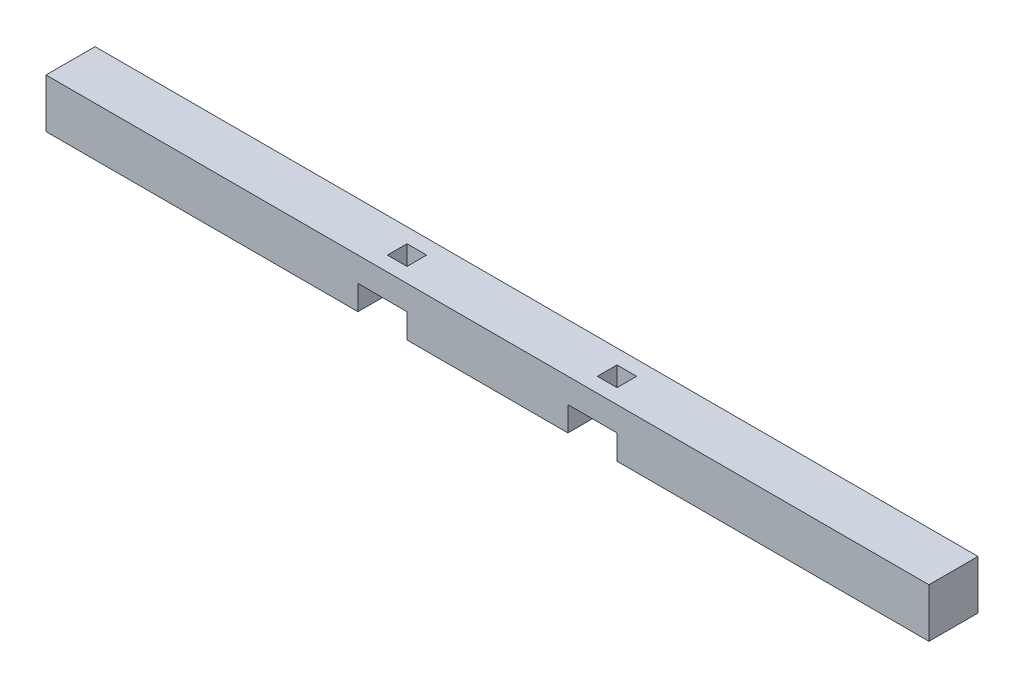
ISO-10303-21;
HEADER;
FILE_DESCRIPTION(('STEP AP214'),'2;1');
FILE_NAME('part.step','',(''),(''),'','','');
FILE_SCHEMA(('AUTOMOTIVE_DESIGN { 1 0 10303 214 1 1 1 1 }'));
ENDSEC;
DATA;
#1=APPLICATION_CONTEXT('core data for automotive mechanical design processes');
#2=APPLICATION_PROTOCOL_DEFINITION('international standard','automotive_design',2000,#1);
#3=PRODUCT_CONTEXT('',#1,'mechanical');
#4=PRODUCT('Part','Part','',(#3));
#5=PRODUCT_RELATED_PRODUCT_CATEGORY('part','',(#4));
#6=PRODUCT_DEFINITION_FORMATION('','',#4);
#7=PRODUCT_DEFINITION_CONTEXT('part definition',#1,'design');
#8=PRODUCT_DEFINITION('design','',#6,#7);
#9=PRODUCT_DEFINITION_SHAPE('','',#8);
#10=(LENGTH_UNIT() NAMED_UNIT(*) SI_UNIT(.MILLI.,.METRE.));
#11=(NAMED_UNIT(*) PLANE_ANGLE_UNIT() SI_UNIT($,.RADIAN.));
#12=(NAMED_UNIT(*) SI_UNIT($,.STERADIAN.) SOLID_ANGLE_UNIT());
#13=UNCERTAINTY_MEASURE_WITH_UNIT(LENGTH_MEASURE(1.E-05),#10,'distance_accuracy_value','');
#14=(GEOMETRIC_REPRESENTATION_CONTEXT(3) GLOBAL_UNCERTAINTY_ASSIGNED_CONTEXT((#13)) GLOBAL_UNIT_ASSIGNED_CONTEXT((#10,
#11,#12)) REPRESENTATION_CONTEXT('',''));
#15=CARTESIAN_POINT('',(0.,0.,0.));
#16=DIRECTION('',(0.,0.,1.));
#17=DIRECTION('',(1.,0.,0.));
#18=AXIS2_PLACEMENT_3D('',#15,#16,#17);
#19=CARTESIAN_POINT('',(450.,0.,0.));
#20=DIRECTION('',(0.,1.,0.));
#21=DIRECTION('',(0.,0.,1.));
#22=AXIS2_PLACEMENT_3D('',#19,#20,#21);
#23=PLANE('',#22);
#24=DIRECTION('',(-1.,0.,0.));
#25=VECTOR('',#24,1.);
#26=CARTESIAN_POINT('',(450.,0.,0.));
#27=LINE('',#26,#25);
#28=CARTESIAN_POINT('',(266.,0.,0.));
#29=VERTEX_POINT('',#28);
#30=CARTESIAN_POINT('',(184.,0.,0.));
#31=VERTEX_POINT('',#30);
#32=EDGE_CURVE('E322',#29,#31,#27,.T.);
#33=ORIENTED_EDGE('',*,*,#32,.T.);
#34=DIRECTION('',(0.,0.,1.));
#35=VECTOR('',#34,1.);
#36=CARTESIAN_POINT('',(184.,0.,0.));
#37=LINE('',#36,#35);
#38=CARTESIAN_POINT('',(184.,0.,-25.));
#39=VERTEX_POINT('',#38);
#40=EDGE_CURVE('E183',#39,#31,#37,.T.);
#41=ORIENTED_EDGE('',*,*,#40,.F.);
#42=DIRECTION('',(-1.,0.,0.));
#43=VECTOR('',#42,1.);
#44=CARTESIAN_POINT('',(450.,0.,-25.));
#45=LINE('',#44,#43);
#46=CARTESIAN_POINT('',(266.,0.,-25.));
#47=VERTEX_POINT('',#46);
#48=EDGE_CURVE('E319',#47,#39,#45,.T.);
#49=ORIENTED_EDGE('',*,*,#48,.F.);
#50=DIRECTION('',(0.,0.,-1.));
#51=VECTOR('',#50,1.);
#52=CARTESIAN_POINT('',(266.,0.,0.));
#53=LINE('',#52,#51);
#54=EDGE_CURVE('E218',#29,#47,#53,.T.);
#55=ORIENTED_EDGE('',*,*,#54,.F.);
#56=EDGE_LOOP('',(#33,#41,#49,#55));
#57=FACE_BOUND('',#56,.T.);
#58=ADVANCED_FACE('F40',(#57),#23,.F.);
#59=CARTESIAN_POINT('',(450.,0.,0.));
#60=VERTEX_POINT('',#59);
#61=CARTESIAN_POINT('',(291.,0.,0.));
#62=VERTEX_POINT('',#61);
#63=EDGE_CURVE('E320',#60,#62,#27,.T.);
#64=ORIENTED_EDGE('',*,*,#63,.T.);
#65=DIRECTION('',(0.,0.,1.));
#66=VECTOR('',#65,1.);
#67=CARTESIAN_POINT('',(291.,0.,0.));
#68=LINE('',#67,#66);
#69=CARTESIAN_POINT('',(291.,0.,-25.));
#70=VERTEX_POINT('',#69);
#71=EDGE_CURVE('E224',#70,#62,#68,.T.);
#72=ORIENTED_EDGE('',*,*,#71,.F.);
#73=CARTESIAN_POINT('',(450.,0.,-25.));
#74=VERTEX_POINT('',#73);
#75=EDGE_CURVE('E315',#74,#70,#45,.T.);
#76=ORIENTED_EDGE('',*,*,#75,.F.);
#77=DIRECTION('',(0.,0.,-1.));
#78=VECTOR('',#77,1.);
#79=CARTESIAN_POINT('',(450.,0.,0.));
#80=LINE('',#79,#78);
#81=EDGE_CURVE('E293',#60,#74,#80,.T.);
#82=ORIENTED_EDGE('',*,*,#81,.F.);
#83=EDGE_LOOP('',(#64,#72,#76,#82));
#84=FACE_BOUND('',#83,.T.);
#85=ADVANCED_FACE('F347',(#84),#23,.F.);
#86=CARTESIAN_POINT('',(176.5,0.,-7.5));
#87=DIRECTION('',(1.,0.,0.));
#88=DIRECTION('',(0.,0.,-1.));
#89=AXIS2_PLACEMENT_3D('',#86,#87,#88);
#90=PLANE('',#89);
#91=DIRECTION('',(0.,0.,-1.));
#92=VECTOR('',#91,1.);
#93=CARTESIAN_POINT('',(176.5,12.5,-7.5));
#94=LINE('',#93,#92);
#95=CARTESIAN_POINT('',(176.5,12.5,-7.5));
#96=VERTEX_POINT('',#95);
#97=CARTESIAN_POINT('',(176.5,12.5,-17.5));
#98=VERTEX_POINT('',#97);
#99=EDGE_CURVE('E238',#96,#98,#94,.T.);
#100=ORIENTED_EDGE('',*,*,#99,.F.);
#101=DIRECTION('',(0.,1.,0.));
#102=VECTOR('',#101,1.);
#103=CARTESIAN_POINT('',(176.5,0.,-7.5));
#104=LINE('',#103,#102);
#105=CARTESIAN_POINT('',(176.5,25.,-7.5));
#106=VERTEX_POINT('',#105);
#107=EDGE_CURVE('E264',#96,#106,#104,.T.);
#108=ORIENTED_EDGE('',*,*,#107,.T.);
#109=DIRECTION('',(0.,0.,-1.));
#110=VECTOR('',#109,1.);
#111=CARTESIAN_POINT('',(176.5,25.,-7.5));
#112=LINE('',#111,#110);
#113=CARTESIAN_POINT('',(176.5,25.,-17.5));
#114=VERTEX_POINT('',#113);
#115=EDGE_CURVE('E250',#106,#114,#112,.T.);
#116=ORIENTED_EDGE('',*,*,#115,.T.);
#117=DIRECTION('',(0.,1.,0.));
#118=VECTOR('',#117,1.);
#119=CARTESIAN_POINT('',(176.5,0.,-17.5));
#120=LINE('',#119,#118);
#121=EDGE_CURVE('E263',#98,#114,#120,.T.);
#122=ORIENTED_EDGE('',*,*,#121,.F.);
#123=EDGE_LOOP('',(#100,#108,#116,#122));
#124=FACE_BOUND('',#123,.T.);
#125=ADVANCED_FACE('F345',(#124),#90,.F.);
#126=CARTESIAN_POINT('',(166.5,0.,-7.5));
#127=DIRECTION('',(0.,0.,1.));
#128=DIRECTION('',(1.,0.,0.));
#129=AXIS2_PLACEMENT_3D('',#126,#127,#128);
#130=PLANE('',#129);
#131=DIRECTION('',(1.,0.,0.));
#132=VECTOR('',#131,1.);
#133=CARTESIAN_POINT('',(166.5,12.5,-7.5));
#134=LINE('',#133,#132);
#135=CARTESIAN_POINT('',(166.5,12.5,-7.5));
#136=VERTEX_POINT('',#135);
#137=EDGE_CURVE('E236',#136,#96,#134,.T.);
#138=ORIENTED_EDGE('',*,*,#137,.F.);
#139=DIRECTION('',(0.,1.,0.));
#140=VECTOR('',#139,1.);
#141=CARTESIAN_POINT('',(166.5,0.,-7.5));
#142=LINE('',#141,#140);
#143=CARTESIAN_POINT('',(166.5,25.,-7.5));
#144=VERTEX_POINT('',#143);
#145=EDGE_CURVE('E267',#136,#144,#142,.T.);
#146=ORIENTED_EDGE('',*,*,#145,.T.);
#147=DIRECTION('',(1.,0.,0.));
#148=VECTOR('',#147,1.);
#149=CARTESIAN_POINT('',(166.5,25.,-7.5));
#150=LINE('',#149,#148);
#151=EDGE_CURVE('E260',#144,#106,#150,.T.);
#152=ORIENTED_EDGE('',*,*,#151,.T.);
#153=ORIENTED_EDGE('',*,*,#107,.F.);
#154=EDGE_LOOP('',(#138,#146,#152,#153));
#155=FACE_BOUND('',#154,.T.);
#156=ADVANCED_FACE('F343',(#155),#130,.F.);
#157=CARTESIAN_POINT('',(166.5,0.,-7.5));
#158=DIRECTION('',(-1.,0.,0.));
#159=DIRECTION('',(0.,0.,1.));
#160=AXIS2_PLACEMENT_3D('',#157,#158,#159);
#161=PLANE('',#160);
#162=DIRECTION('',(0.,0.,1.));
#163=VECTOR('',#162,1.);
#164=CARTESIAN_POINT('',(166.5,12.5,-7.5));
#165=LINE('',#164,#163);
#166=CARTESIAN_POINT('',(166.5,12.5,-17.5));
#167=VERTEX_POINT('',#166);
#168=EDGE_CURVE('E209',#167,#136,#165,.T.);
#169=ORIENTED_EDGE('',*,*,#168,.F.);
#170=DIRECTION('',(0.,1.,0.));
#171=VECTOR('',#170,1.);
#172=CARTESIAN_POINT('',(166.5,0.,-17.5));
#173=LINE('',#172,#171);
#174=CARTESIAN_POINT('',(166.5,25.,-17.5));
#175=VERTEX_POINT('',#174);
#176=EDGE_CURVE('E269',#167,#175,#173,.T.);
#177=ORIENTED_EDGE('',*,*,#176,.T.);
#178=DIRECTION('',(0.,0.,1.));
#179=VECTOR('',#178,1.);
#180=CARTESIAN_POINT('',(166.5,25.,-7.5));
#181=LINE('',#180,#179);
#182=EDGE_CURVE('E257',#175,#144,#181,.T.);
#183=ORIENTED_EDGE('',*,*,#182,.T.);
#184=ORIENTED_EDGE('',*,*,#145,.F.);
#185=EDGE_LOOP('',(#169,#177,#183,#184));
#186=FACE_BOUND('',#185,.T.);
#187=ADVANCED_FACE('F332',(#186),#161,.F.);
#188=CARTESIAN_POINT('',(166.5,0.,-17.5));
#189=DIRECTION('',(0.,0.,-1.));
#190=DIRECTION('',(-1.,0.,0.));
#191=AXIS2_PLACEMENT_3D('',#188,#189,#190);
#192=PLANE('',#191);
#193=DIRECTION('',(-1.,0.,0.));
#194=VECTOR('',#193,1.);
#195=CARTESIAN_POINT('',(166.5,12.5,-17.5));
#196=LINE('',#195,#194);
#197=EDGE_CURVE('E48',#98,#167,#196,.T.);
#198=ORIENTED_EDGE('',*,*,#197,.F.);
#199=ORIENTED_EDGE('',*,*,#121,.T.);
#200=DIRECTION('',(-1.,0.,0.));
#201=VECTOR('',#200,1.);
#202=CARTESIAN_POINT('',(166.5,25.,-17.5));
#203=LINE('',#202,#201);
#204=EDGE_CURVE('E253',#114,#175,#203,.T.);
#205=ORIENTED_EDGE('',*,*,#204,.T.);
#206=ORIENTED_EDGE('',*,*,#176,.F.);
#207=EDGE_LOOP('',(#198,#199,#205,#206));
#208=FACE_BOUND('',#207,.T.);
#209=ADVANCED_FACE('F333',(#208),#192,.F.);
#210=CARTESIAN_POINT('',(450.,0.,0.));
#211=DIRECTION('',(0.,0.,-1.));
#212=DIRECTION('',(-1.,0.,0.));
#213=AXIS2_PLACEMENT_3D('',#210,#211,#212);
#214=PLANE('',#213);
#215=DIRECTION('',(-1.,0.,0.));
#216=VECTOR('',#215,1.);
#217=CARTESIAN_POINT('',(159.,12.5,0.));
#218=LINE('',#217,#216);
#219=CARTESIAN_POINT('',(184.,12.5,0.));
#220=VERTEX_POINT('',#219);
#221=CARTESIAN_POINT('',(159.,12.5,0.));
#222=VERTEX_POINT('',#221);
#223=EDGE_CURVE('E193',#220,#222,#218,.T.);
#224=ORIENTED_EDGE('',*,*,#223,.F.);
#225=DIRECTION('',(0.,-1.,0.));
#226=VECTOR('',#225,1.);
#227=CARTESIAN_POINT('',(184.,12.5,0.));
#228=LINE('',#227,#226);
#229=EDGE_CURVE('E178',#220,#31,#228,.T.);
#230=ORIENTED_EDGE('',*,*,#229,.T.);
#231=ORIENTED_EDGE('',*,*,#32,.F.);
#232=DIRECTION('',(0.,-1.,0.));
#233=VECTOR('',#232,1.);
#234=CARTESIAN_POINT('',(266.,12.5,0.));
#235=LINE('',#234,#233);
#236=CARTESIAN_POINT('',(266.,12.5,0.));
#237=VERTEX_POINT('',#236);
#238=EDGE_CURVE('E231',#237,#29,#235,.T.);
#239=ORIENTED_EDGE('',*,*,#238,.F.);
#240=DIRECTION('',(-1.,0.,0.));
#241=VECTOR('',#240,1.);
#242=CARTESIAN_POINT('',(291.,12.5,0.));
#243=LINE('',#242,#241);
#244=CARTESIAN_POINT('',(291.,12.5,0.));
#245=VERTEX_POINT('',#244);
#246=EDGE_CURVE('E217',#245,#237,#243,.T.);
#247=ORIENTED_EDGE('',*,*,#246,.F.);
#248=DIRECTION('',(0.,-1.,0.));
#249=VECTOR('',#248,1.);
#250=CARTESIAN_POINT('',(291.,12.5,0.));
#251=LINE('',#250,#249);
#252=EDGE_CURVE('E223',#245,#62,#251,.T.);
#253=ORIENTED_EDGE('',*,*,#252,.T.);
#254=ORIENTED_EDGE('',*,*,#63,.F.);
#255=DIRECTION('',(0.,-1.,0.));
#256=VECTOR('',#255,1.);
#257=CARTESIAN_POINT('',(450.,0.,0.));
#258=LINE('',#257,#256);
#259=CARTESIAN_POINT('',(450.,25.,0.));
#260=VERTEX_POINT('',#259);
#261=EDGE_CURVE('E290',#260,#60,#258,.T.);
#262=ORIENTED_EDGE('',*,*,#261,.F.);
#263=DIRECTION('',(-1.,0.,0.));
#264=VECTOR('',#263,1.);
#265=CARTESIAN_POINT('',(450.,25.,0.));
#266=LINE('',#265,#264);
#267=CARTESIAN_POINT('',(0.,25.,0.));
#268=VERTEX_POINT('',#267);
#269=EDGE_CURVE('E300',#260,#268,#266,.T.);
#270=ORIENTED_EDGE('',*,*,#269,.T.);
#271=DIRECTION('',(0.,-1.,0.));
#272=VECTOR('',#271,1.);
#273=CARTESIAN_POINT('',(0.,0.,0.));
#274=LINE('',#273,#272);
#275=CARTESIAN_POINT('',(0.,0.,0.));
#276=VERTEX_POINT('',#275);
#277=EDGE_CURVE('E266',#268,#276,#274,.T.);
#278=ORIENTED_EDGE('',*,*,#277,.T.);
#279=CARTESIAN_POINT('',(159.,0.,0.));
#280=VERTEX_POINT('',#279);
#281=EDGE_CURVE('E318',#280,#276,#27,.T.);
#282=ORIENTED_EDGE('',*,*,#281,.F.);
#283=DIRECTION('',(0.,-1.,0.));
#284=VECTOR('',#283,1.);
#285=CARTESIAN_POINT('',(159.,12.5,0.));
#286=LINE('',#285,#284);
#287=EDGE_CURVE('E188',#222,#280,#286,.T.);
#288=ORIENTED_EDGE('',*,*,#287,.F.);
#289=EDGE_LOOP('',(#224,#230,#231,#239,#247,#253,#254,#262,#270,#278,#282,#288));
#290=FACE_BOUND('',#289,.T.);
#291=ADVANCED_FACE('F42',(#290),#214,.F.);
#292=CARTESIAN_POINT('',(159.,0.,-25.));
#293=VERTEX_POINT('',#292);
#294=CARTESIAN_POINT('',(0.,0.,-25.));
#295=VERTEX_POINT('',#294);
#296=EDGE_CURVE('E314',#293,#295,#45,.T.);
#297=ORIENTED_EDGE('',*,*,#296,.F.);
#298=DIRECTION('',(0.,0.,-1.));
#299=VECTOR('',#298,1.);
#300=CARTESIAN_POINT('',(159.,0.,0.));
#301=LINE('',#300,#299);
#302=EDGE_CURVE('E197',#280,#293,#301,.T.);
#303=ORIENTED_EDGE('',*,*,#302,.F.);
#304=ORIENTED_EDGE('',*,*,#281,.T.);
#305=DIRECTION('',(0.,0.,-1.));
#306=VECTOR('',#305,1.);
#307=CARTESIAN_POINT('',(0.,0.,0.));
#308=LINE('',#307,#306);
#309=EDGE_CURVE('E303',#276,#295,#308,.T.);
#310=ORIENTED_EDGE('',*,*,#309,.T.);
#311=EDGE_LOOP('',(#297,#303,#304,#310));
#312=FACE_BOUND('',#311,.T.);
#313=ADVANCED_FACE('F355',(#312),#23,.F.);
#314=CARTESIAN_POINT('',(450.,0.,-25.));
#315=DIRECTION('',(0.,0.,1.));
#316=DIRECTION('',(1.,0.,0.));
#317=AXIS2_PLACEMENT_3D('',#314,#315,#316);
#318=PLANE('',#317);
#319=ORIENTED_EDGE('',*,*,#48,.T.);
#320=DIRECTION('',(0.,-1.,0.));
#321=VECTOR('',#320,1.);
#322=CARTESIAN_POINT('',(184.,12.5,-25.));
#323=LINE('',#322,#321);
#324=CARTESIAN_POINT('',(184.,12.5,-25.));
#325=VERTEX_POINT('',#324);
#326=EDGE_CURVE('E207',#325,#39,#323,.T.);
#327=ORIENTED_EDGE('',*,*,#326,.F.);
#328=DIRECTION('',(1.,0.,0.));
#329=VECTOR('',#328,1.);
#330=CARTESIAN_POINT('',(159.,12.5,-25.));
#331=LINE('',#330,#329);
#332=CARTESIAN_POINT('',(159.,12.5,-25.));
#333=VERTEX_POINT('',#332);
#334=EDGE_CURVE('E189',#333,#325,#331,.T.);
#335=ORIENTED_EDGE('',*,*,#334,.F.);
#336=DIRECTION('',(0.,-1.,0.));
#337=VECTOR('',#336,1.);
#338=CARTESIAN_POINT('',(159.,12.5,-25.));
#339=LINE('',#338,#337);
#340=EDGE_CURVE('E210',#333,#293,#339,.T.);
#341=ORIENTED_EDGE('',*,*,#340,.T.);
#342=ORIENTED_EDGE('',*,*,#296,.T.);
#343=DIRECTION('',(0.,1.,0.));
#344=VECTOR('',#343,1.);
#345=CARTESIAN_POINT('',(0.,0.,-25.));
#346=LINE('',#345,#344);
#347=CARTESIAN_POINT('',(0.,25.,-25.));
#348=VERTEX_POINT('',#347);
#349=EDGE_CURVE('E306',#295,#348,#346,.T.);
#350=ORIENTED_EDGE('',*,*,#349,.T.);
#351=DIRECTION('',(-1.,0.,0.));
#352=VECTOR('',#351,1.);
#353=CARTESIAN_POINT('',(450.,25.,-25.));
#354=LINE('',#353,#352);
#355=CARTESIAN_POINT('',(450.,25.,-25.));
#356=VERTEX_POINT('',#355);
#357=EDGE_CURVE('E311',#356,#348,#354,.T.);
#358=ORIENTED_EDGE('',*,*,#357,.F.);
#359=DIRECTION('',(0.,1.,0.));
#360=VECTOR('',#359,1.);
#361=CARTESIAN_POINT('',(450.,0.,-25.));
#362=LINE('',#361,#360);
#363=EDGE_CURVE('E296',#74,#356,#362,.T.);
#364=ORIENTED_EDGE('',*,*,#363,.F.);
#365=ORIENTED_EDGE('',*,*,#75,.T.);
#366=DIRECTION('',(0.,-1.,0.));
#367=VECTOR('',#366,1.);
#368=CARTESIAN_POINT('',(291.,12.5,-25.));
#369=LINE('',#368,#367);
#370=CARTESIAN_POINT('',(291.,12.5,-25.));
#371=VERTEX_POINT('',#370);
#372=EDGE_CURVE('E205',#371,#70,#369,.T.);
#373=ORIENTED_EDGE('',*,*,#372,.F.);
#374=DIRECTION('',(1.,0.,0.));
#375=VECTOR('',#374,1.);
#376=CARTESIAN_POINT('',(291.,12.5,-25.));
#377=LINE('',#376,#375);
#378=CARTESIAN_POINT('',(266.,12.5,-25.));
#379=VERTEX_POINT('',#378);
#380=EDGE_CURVE('E221',#379,#371,#377,.T.);
#381=ORIENTED_EDGE('',*,*,#380,.F.);
#382=DIRECTION('',(0.,-1.,0.));
#383=VECTOR('',#382,1.);
#384=CARTESIAN_POINT('',(266.,12.5,-25.));
#385=LINE('',#384,#383);
#386=EDGE_CURVE('E228',#379,#47,#385,.T.);
#387=ORIENTED_EDGE('',*,*,#386,.T.);
#388=EDGE_LOOP('',(#319,#327,#335,#341,#342,#350,#358,#364,#365,#373,#381,#387));
#389=FACE_BOUND('',#388,.T.);
#390=ADVANCED_FACE('F364',(#389),#318,.F.);
#391=CARTESIAN_POINT('',(450.,25.,0.));
#392=DIRECTION('',(0.,-1.,0.));
#393=DIRECTION('',(0.,0.,-1.));
#394=AXIS2_PLACEMENT_3D('',#391,#392,#393);
#395=PLANE('',#394);
#396=ORIENTED_EDGE('',*,*,#204,.F.);
#397=ORIENTED_EDGE('',*,*,#115,.F.);
#398=ORIENTED_EDGE('',*,*,#151,.F.);
#399=ORIENTED_EDGE('',*,*,#182,.F.);
#400=EDGE_LOOP('',(#396,#397,#398,#399));
#401=FACE_BOUND('',#400,.T.);
#402=DIRECTION('',(-1.,0.,0.));
#403=VECTOR('',#402,1.);
#404=CARTESIAN_POINT('',(283.5,25.,-17.5));
#405=LINE('',#404,#403);
#406=CARTESIAN_POINT('',(283.5,25.,-17.5));
#407=VERTEX_POINT('',#406);
#408=CARTESIAN_POINT('',(273.5,25.,-17.5));
#409=VERTEX_POINT('',#408);
#410=EDGE_CURVE('E274',#407,#409,#405,.T.);
#411=ORIENTED_EDGE('',*,*,#410,.F.);
#412=DIRECTION('',(0.,0.,-1.));
#413=VECTOR('',#412,1.);
#414=CARTESIAN_POINT('',(283.5,25.,-7.50000000000001));
#415=LINE('',#414,#413);
#416=CARTESIAN_POINT('',(283.5,25.,-7.50000000000001));
#417=VERTEX_POINT('',#416);
#418=EDGE_CURVE('E249',#417,#407,#415,.T.);
#419=ORIENTED_EDGE('',*,*,#418,.F.);
#420=DIRECTION('',(1.,0.,0.));
#421=VECTOR('',#420,1.);
#422=CARTESIAN_POINT('',(283.5,25.,-7.50000000000001));
#423=LINE('',#422,#421);
#424=CARTESIAN_POINT('',(273.5,25.,-7.50000000000001));
#425=VERTEX_POINT('',#424);
#426=EDGE_CURVE('E280',#425,#417,#423,.T.);
#427=ORIENTED_EDGE('',*,*,#426,.F.);
#428=DIRECTION('',(0.,0.,1.));
#429=VECTOR('',#428,1.);
#430=CARTESIAN_POINT('',(273.5,25.,-7.50000000000001));
#431=LINE('',#430,#429);
#432=EDGE_CURVE('E277',#409,#425,#431,.T.);
#433=ORIENTED_EDGE('',*,*,#432,.F.);
#434=EDGE_LOOP('',(#411,#419,#427,#433));
#435=FACE_BOUND('',#434,.T.);
#436=DIRECTION('',(0.,0.,1.));
#437=VECTOR('',#436,1.);
#438=CARTESIAN_POINT('',(0.,25.,0.));
#439=LINE('',#438,#437);
#440=EDGE_CURVE('E294',#348,#268,#439,.T.);
#441=ORIENTED_EDGE('',*,*,#440,.T.);
#442=ORIENTED_EDGE('',*,*,#269,.F.);
#443=DIRECTION('',(0.,0.,1.));
#444=VECTOR('',#443,1.);
#445=CARTESIAN_POINT('',(450.,25.,0.));
#446=LINE('',#445,#444);
#447=EDGE_CURVE('E298',#356,#260,#446,.T.);
#448=ORIENTED_EDGE('',*,*,#447,.F.);
#449=ORIENTED_EDGE('',*,*,#357,.T.);
#450=EDGE_LOOP('',(#441,#442,#448,#449));
#451=FACE_BOUND('',#450,.T.);
#452=ADVANCED_FACE('F339',(#401,#435,#451),#395,.F.);
#453=CARTESIAN_POINT('',(450.,0.,0.));
#454=DIRECTION('',(-1.,0.,0.));
#455=DIRECTION('',(0.,0.,1.));
#456=AXIS2_PLACEMENT_3D('',#453,#454,#455);
#457=PLANE('',#456);
#458=ORIENTED_EDGE('',*,*,#261,.T.);
#459=ORIENTED_EDGE('',*,*,#81,.T.);
#460=ORIENTED_EDGE('',*,*,#363,.T.);
#461=ORIENTED_EDGE('',*,*,#447,.T.);
#462=EDGE_LOOP('',(#458,#459,#460,#461));
#463=FACE_BOUND('',#462,.T.);
#464=ADVANCED_FACE('F394',(#463),#457,.F.);
#465=CARTESIAN_POINT('',(0.,0.,0.));
#466=DIRECTION('',(-1.,0.,0.));
#467=DIRECTION('',(0.,0.,1.));
#468=AXIS2_PLACEMENT_3D('',#465,#466,#467);
#469=PLANE('',#468);
#470=ORIENTED_EDGE('',*,*,#277,.F.);
#471=ORIENTED_EDGE('',*,*,#440,.F.);
#472=ORIENTED_EDGE('',*,*,#349,.F.);
#473=ORIENTED_EDGE('',*,*,#309,.F.);
#474=EDGE_LOOP('',(#470,#471,#472,#473));
#475=FACE_BOUND('',#474,.T.);
#476=ADVANCED_FACE('F382',(#475),#469,.T.);
#477=CARTESIAN_POINT('',(283.5,0.,-7.50000000000001));
#478=DIRECTION('',(1.,0.,0.));
#479=DIRECTION('',(0.,0.,-1.));
#480=AXIS2_PLACEMENT_3D('',#477,#478,#479);
#481=PLANE('',#480);
#482=DIRECTION('',(0.,1.,0.));
#483=VECTOR('',#482,1.);
#484=CARTESIAN_POINT('',(283.5,0.,-17.5));
#485=LINE('',#484,#483);
#486=CARTESIAN_POINT('',(283.5,12.5,-17.5));
#487=VERTEX_POINT('',#486);
#488=EDGE_CURVE('E283',#487,#407,#485,.T.);
#489=ORIENTED_EDGE('',*,*,#488,.F.);
#490=DIRECTION('',(0.,0.,1.));
#491=VECTOR('',#490,1.);
#492=CARTESIAN_POINT('',(283.5,12.5,-7.50000000000001));
#493=LINE('',#492,#491);
#494=CARTESIAN_POINT('',(283.5,12.5,-7.50000000000001));
#495=VERTEX_POINT('',#494);
#496=EDGE_CURVE('E246',#487,#495,#493,.T.);
#497=ORIENTED_EDGE('',*,*,#496,.T.);
#498=DIRECTION('',(0.,1.,0.));
#499=VECTOR('',#498,1.);
#500=CARTESIAN_POINT('',(283.5,0.,-7.50000000000001));
#501=LINE('',#500,#499);
#502=EDGE_CURVE('E254',#495,#417,#501,.T.);
#503=ORIENTED_EDGE('',*,*,#502,.T.);
#504=ORIENTED_EDGE('',*,*,#418,.T.);
#505=EDGE_LOOP('',(#489,#497,#503,#504));
#506=FACE_BOUND('',#505,.T.);
#507=ADVANCED_FACE('F419',(#506),#481,.F.);
#508=CARTESIAN_POINT('',(283.5,0.,-7.50000000000001));
#509=DIRECTION('',(0.,0.,1.));
#510=DIRECTION('',(1.,0.,0.));
#511=AXIS2_PLACEMENT_3D('',#508,#509,#510);
#512=PLANE('',#511);
#513=ORIENTED_EDGE('',*,*,#502,.F.);
#514=DIRECTION('',(-1.,0.,0.));
#515=VECTOR('',#514,1.);
#516=CARTESIAN_POINT('',(283.5,12.5,-7.50000000000001));
#517=LINE('',#516,#515);
#518=CARTESIAN_POINT('',(273.5,12.5,-7.50000000000001));
#519=VERTEX_POINT('',#518);
#520=EDGE_CURVE('E243',#495,#519,#517,.T.);
#521=ORIENTED_EDGE('',*,*,#520,.T.);
#522=DIRECTION('',(0.,1.,0.));
#523=VECTOR('',#522,1.);
#524=CARTESIAN_POINT('',(273.5,0.,-7.50000000000001));
#525=LINE('',#524,#523);
#526=EDGE_CURVE('E285',#519,#425,#525,.T.);
#527=ORIENTED_EDGE('',*,*,#526,.T.);
#528=ORIENTED_EDGE('',*,*,#426,.T.);
#529=EDGE_LOOP('',(#513,#521,#527,#528));
#530=FACE_BOUND('',#529,.T.);
#531=ADVANCED_FACE('F417',(#530),#512,.F.);
#532=CARTESIAN_POINT('',(273.5,0.,-7.50000000000001));
#533=DIRECTION('',(-1.,0.,0.));
#534=DIRECTION('',(0.,0.,1.));
#535=AXIS2_PLACEMENT_3D('',#532,#533,#534);
#536=PLANE('',#535);
#537=ORIENTED_EDGE('',*,*,#526,.F.);
#538=DIRECTION('',(0.,0.,-1.));
#539=VECTOR('',#538,1.);
#540=CARTESIAN_POINT('',(273.5,12.5,-7.50000000000001));
#541=LINE('',#540,#539);
#542=CARTESIAN_POINT('',(273.5,12.5,-17.5));
#543=VERTEX_POINT('',#542);
#544=EDGE_CURVE('E240',#519,#543,#541,.T.);
#545=ORIENTED_EDGE('',*,*,#544,.T.);
#546=DIRECTION('',(0.,1.,0.));
#547=VECTOR('',#546,1.);
#548=CARTESIAN_POINT('',(273.5,0.,-17.5));
#549=LINE('',#548,#547);
#550=EDGE_CURVE('E287',#543,#409,#549,.T.);
#551=ORIENTED_EDGE('',*,*,#550,.T.);
#552=ORIENTED_EDGE('',*,*,#432,.T.);
#553=EDGE_LOOP('',(#537,#545,#551,#552));
#554=FACE_BOUND('',#553,.T.);
#555=ADVANCED_FACE('F409',(#554),#536,.F.);
#556=CARTESIAN_POINT('',(283.5,0.,-17.5));
#557=DIRECTION('',(0.,0.,-1.));
#558=DIRECTION('',(-1.,0.,0.));
#559=AXIS2_PLACEMENT_3D('',#556,#557,#558);
#560=PLANE('',#559);
#561=ORIENTED_EDGE('',*,*,#550,.F.);
#562=DIRECTION('',(1.,0.,0.));
#563=VECTOR('',#562,1.);
#564=CARTESIAN_POINT('',(283.5,12.5,-17.5));
#565=LINE('',#564,#563);
#566=EDGE_CURVE('E11',#543,#487,#565,.T.);
#567=ORIENTED_EDGE('',*,*,#566,.T.);
#568=ORIENTED_EDGE('',*,*,#488,.T.);
#569=ORIENTED_EDGE('',*,*,#410,.T.);
#570=EDGE_LOOP('',(#561,#567,#568,#569));
#571=FACE_BOUND('',#570,.T.);
#572=ADVANCED_FACE('F410',(#571),#560,.F.);
#573=CARTESIAN_POINT('',(0.,12.5,0.));
#574=DIRECTION('',(0.,-1.,0.));
#575=DIRECTION('',(0.,0.,-1.));
#576=AXIS2_PLACEMENT_3D('',#573,#574,#575);
#577=PLANE('',#576);
#578=DIRECTION('',(0.,0.,1.));
#579=VECTOR('',#578,1.);
#580=CARTESIAN_POINT('',(184.,12.5,0.));
#581=LINE('',#580,#579);
#582=EDGE_CURVE('E181',#325,#220,#581,.T.);
#583=ORIENTED_EDGE('',*,*,#582,.T.);
#584=ORIENTED_EDGE('',*,*,#223,.T.);
#585=DIRECTION('',(0.,0.,-1.));
#586=VECTOR('',#585,1.);
#587=CARTESIAN_POINT('',(159.,12.5,0.));
#588=LINE('',#587,#586);
#589=EDGE_CURVE('E55',#222,#333,#588,.T.);
#590=ORIENTED_EDGE('',*,*,#589,.T.);
#591=ORIENTED_EDGE('',*,*,#334,.T.);
#592=EDGE_LOOP('',(#583,#584,#590,#591));
#593=FACE_BOUND('',#592,.T.);
#594=ORIENTED_EDGE('',*,*,#99,.T.);
#595=ORIENTED_EDGE('',*,*,#197,.T.);
#596=ORIENTED_EDGE('',*,*,#168,.T.);
#597=ORIENTED_EDGE('',*,*,#137,.T.);
#598=EDGE_LOOP('',(#594,#595,#596,#597));
#599=FACE_BOUND('',#598,.T.);
#600=ADVANCED_FACE('F191',(#593,#599),#577,.T.);
#601=CARTESIAN_POINT('',(184.,12.5,0.));
#602=DIRECTION('',(1.,0.,0.));
#603=DIRECTION('',(0.,0.,-1.));
#604=AXIS2_PLACEMENT_3D('',#601,#602,#603);
#605=PLANE('',#604);
#606=ORIENTED_EDGE('',*,*,#40,.T.);
#607=ORIENTED_EDGE('',*,*,#229,.F.);
#608=ORIENTED_EDGE('',*,*,#582,.F.);
#609=ORIENTED_EDGE('',*,*,#326,.T.);
#610=EDGE_LOOP('',(#606,#607,#608,#609));
#611=FACE_BOUND('',#610,.T.);
#612=ADVANCED_FACE('F180',(#611),#605,.F.);
#613=CARTESIAN_POINT('',(159.,12.5,0.));
#614=DIRECTION('',(-1.,0.,0.));
#615=DIRECTION('',(0.,0.,1.));
#616=AXIS2_PLACEMENT_3D('',#613,#614,#615);
#617=PLANE('',#616);
#618=ORIENTED_EDGE('',*,*,#302,.T.);
#619=ORIENTED_EDGE('',*,*,#340,.F.);
#620=ORIENTED_EDGE('',*,*,#589,.F.);
#621=ORIENTED_EDGE('',*,*,#287,.T.);
#622=EDGE_LOOP('',(#618,#619,#620,#621));
#623=FACE_BOUND('',#622,.T.);
#624=ADVANCED_FACE('F402',(#623),#617,.F.);
#625=CARTESIAN_POINT('',(0.,12.5,0.));
#626=DIRECTION('',(0.,1.,0.));
#627=DIRECTION('',(0.,0.,1.));
#628=AXIS2_PLACEMENT_3D('',#625,#626,#627);
#629=PLANE('',#628);
#630=DIRECTION('',(0.,0.,1.));
#631=VECTOR('',#630,1.);
#632=CARTESIAN_POINT('',(291.,12.5,0.));
#633=LINE('',#632,#631);
#634=EDGE_CURVE('E214',#371,#245,#633,.T.);
#635=ORIENTED_EDGE('',*,*,#634,.T.);
#636=ORIENTED_EDGE('',*,*,#246,.T.);
#637=DIRECTION('',(0.,0.,-1.));
#638=VECTOR('',#637,1.);
#639=CARTESIAN_POINT('',(266.,12.5,0.));
#640=LINE('',#639,#638);
#641=EDGE_CURVE('E63',#237,#379,#640,.T.);
#642=ORIENTED_EDGE('',*,*,#641,.T.);
#643=ORIENTED_EDGE('',*,*,#380,.T.);
#644=EDGE_LOOP('',(#635,#636,#642,#643));
#645=FACE_BOUND('',#644,.T.);
#646=ORIENTED_EDGE('',*,*,#566,.F.);
#647=ORIENTED_EDGE('',*,*,#544,.F.);
#648=ORIENTED_EDGE('',*,*,#520,.F.);
#649=ORIENTED_EDGE('',*,*,#496,.F.);
#650=EDGE_LOOP('',(#646,#647,#648,#649));
#651=FACE_BOUND('',#650,.T.);
#652=ADVANCED_FACE('F399',(#645,#651),#629,.F.);
#653=CARTESIAN_POINT('',(291.,12.5,0.));
#654=DIRECTION('',(1.,0.,0.));
#655=DIRECTION('',(0.,0.,-1.));
#656=AXIS2_PLACEMENT_3D('',#653,#654,#655);
#657=PLANE('',#656);
#658=ORIENTED_EDGE('',*,*,#71,.T.);
#659=ORIENTED_EDGE('',*,*,#252,.F.);
#660=ORIENTED_EDGE('',*,*,#634,.F.);
#661=ORIENTED_EDGE('',*,*,#372,.T.);
#662=EDGE_LOOP('',(#658,#659,#660,#661));
#663=FACE_BOUND('',#662,.T.);
#664=ADVANCED_FACE('F397',(#663),#657,.F.);
#665=CARTESIAN_POINT('',(266.,12.5,0.));
#666=DIRECTION('',(-1.,0.,0.));
#667=DIRECTION('',(0.,0.,1.));
#668=AXIS2_PLACEMENT_3D('',#665,#666,#667);
#669=PLANE('',#668);
#670=ORIENTED_EDGE('',*,*,#54,.T.);
#671=ORIENTED_EDGE('',*,*,#386,.F.);
#672=ORIENTED_EDGE('',*,*,#641,.F.);
#673=ORIENTED_EDGE('',*,*,#238,.T.);
#674=EDGE_LOOP('',(#670,#671,#672,#673));
#675=FACE_BOUND('',#674,.T.);
#676=ADVANCED_FACE('F539',(#675),#669,.F.);
#677=CLOSED_SHELL('',(#58,#85,#125,#156,#187,#209,#291,#313,#390,#452,#464,#476,#507,#531,#555,
#572,#600,#612,#624,#652,#664,#676));
#678=MANIFOLD_SOLID_BREP('B2',#677);
#679=ADVANCED_BREP_SHAPE_REPRESENTATION('',(#18,#678),#14);
#680=SHAPE_DEFINITION_REPRESENTATION(#9,#679);
ENDSEC;
END-ISO-10303-21;
